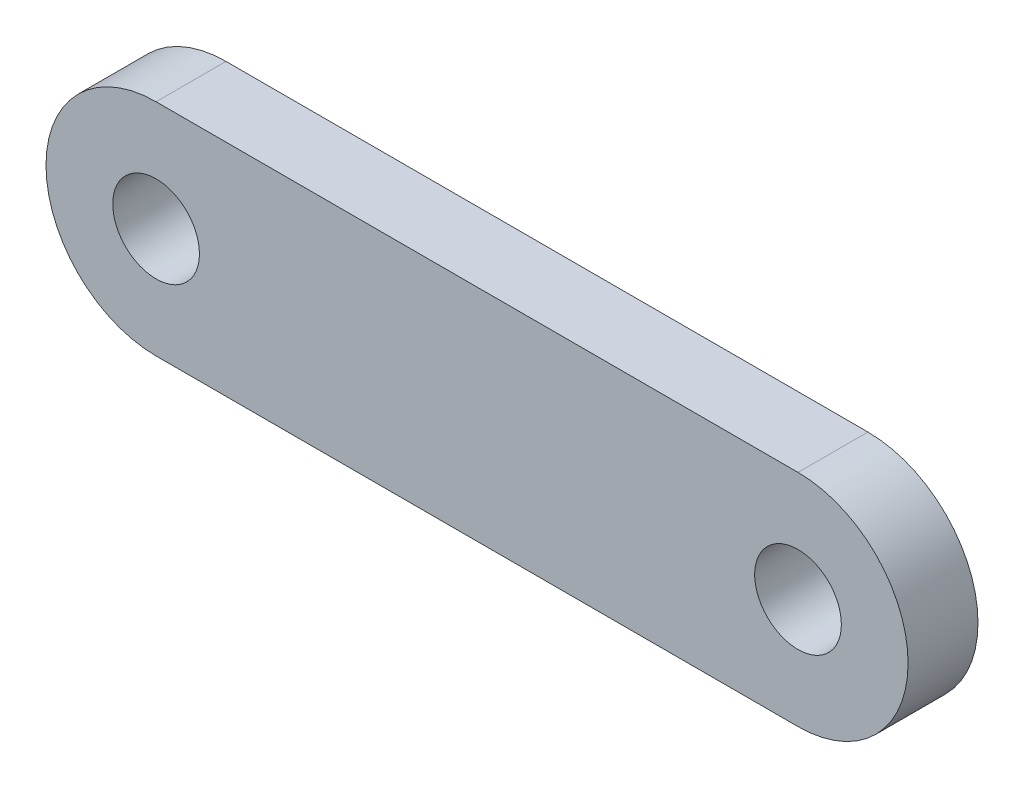
ISO-10303-21;
HEADER;
FILE_DESCRIPTION(('STEP AP214'),'2;1');
FILE_NAME('part.step','',(''),(''),'','','');
FILE_SCHEMA(('AUTOMOTIVE_DESIGN { 1 0 10303 214 1 1 1 1 }'));
ENDSEC;
DATA;
#1=APPLICATION_CONTEXT('core data for automotive mechanical design processes');
#2=APPLICATION_PROTOCOL_DEFINITION('international standard','automotive_design',2000,#1);
#3=PRODUCT_CONTEXT('',#1,'mechanical');
#4=PRODUCT('Part','Part','',(#3));
#5=PRODUCT_RELATED_PRODUCT_CATEGORY('part','',(#4));
#6=PRODUCT_DEFINITION_FORMATION('','',#4);
#7=PRODUCT_DEFINITION_CONTEXT('part definition',#1,'design');
#8=PRODUCT_DEFINITION('design','',#6,#7);
#9=PRODUCT_DEFINITION_SHAPE('','',#8);
#10=(LENGTH_UNIT() NAMED_UNIT(*) SI_UNIT(.MILLI.,.METRE.));
#11=(NAMED_UNIT(*) PLANE_ANGLE_UNIT() SI_UNIT($,.RADIAN.));
#12=(NAMED_UNIT(*) SI_UNIT($,.STERADIAN.) SOLID_ANGLE_UNIT());
#13=UNCERTAINTY_MEASURE_WITH_UNIT(LENGTH_MEASURE(1.E-05),#10,'distance_accuracy_value','');
#14=(GEOMETRIC_REPRESENTATION_CONTEXT(3) GLOBAL_UNCERTAINTY_ASSIGNED_CONTEXT((#13)) GLOBAL_UNIT_ASSIGNED_CONTEXT((#10,
#11,#12)) REPRESENTATION_CONTEXT('',''));
#15=CARTESIAN_POINT('',(0.,0.,0.));
#16=DIRECTION('',(0.,0.,1.));
#17=DIRECTION('',(1.,0.,0.));
#18=AXIS2_PLACEMENT_3D('',#15,#16,#17);
#19=CARTESIAN_POINT('',(-29.15466953,0.,6.35));
#20=DIRECTION('',(0.,0.,1.));
#21=DIRECTION('',(1.,0.,0.));
#22=AXIS2_PLACEMENT_3D('',#19,#20,#21);
#23=PLANE('',#22);
#24=CARTESIAN_POINT('',(-29.15466953,0.,6.35));
#25=DIRECTION('',(0.,0.,1.));
#26=DIRECTION('',(1.,0.,0.));
#27=AXIS2_PLACEMENT_3D('',#24,#25,#26);
#28=CIRCLE('',#27,3.9375);
#29=CARTESIAN_POINT('',(-25.21716953,0.,6.35));
#30=VERTEX_POINT('',#29);
#31=EDGE_CURVE('E125',#30,#30,#28,.T.);
#32=ORIENTED_EDGE('',*,*,#31,.F.);
#33=EDGE_LOOP('',(#32));
#34=FACE_BOUND('',#33,.T.);
#35=CARTESIAN_POINT('',(-29.15466953,0.,6.35));
#36=DIRECTION('',(0.,0.,1.));
#37=DIRECTION('',(1.,0.,0.));
#38=AXIS2_PLACEMENT_3D('',#35,#36,#37);
#39=CIRCLE('',#38,10.);
#40=CARTESIAN_POINT('',(-29.15466953,10.,6.35));
#41=VERTEX_POINT('',#40);
#42=CARTESIAN_POINT('',(-29.15466953,-10.,6.35));
#43=VERTEX_POINT('',#42);
#44=EDGE_CURVE('E99',#41,#43,#39,.T.);
#45=ORIENTED_EDGE('',*,*,#44,.T.);
#46=DIRECTION('',(1.,0.,0.));
#47=VECTOR('',#46,1.);
#48=CARTESIAN_POINT('',(-29.15466953,-10.,6.35));
#49=LINE('',#48,#47);
#50=CARTESIAN_POINT('',(29.15466953,-9.99999999999999,6.35));
#51=VERTEX_POINT('',#50);
#52=EDGE_CURVE('E95',#43,#51,#49,.T.);
#53=ORIENTED_EDGE('',*,*,#52,.T.);
#54=CARTESIAN_POINT('',(29.15466953,0.,6.35));
#55=DIRECTION('',(0.,0.,1.));
#56=DIRECTION('',(1.,0.,0.));
#57=AXIS2_PLACEMENT_3D('',#54,#55,#56);
#58=CIRCLE('',#57,10.);
#59=CARTESIAN_POINT('',(29.15466953,10.,6.35));
#60=VERTEX_POINT('',#59);
#61=EDGE_CURVE('E96',#51,#60,#58,.T.);
#62=ORIENTED_EDGE('',*,*,#61,.T.);
#63=DIRECTION('',(-1.,0.,0.));
#64=VECTOR('',#63,1.);
#65=CARTESIAN_POINT('',(-29.15466953,10.,6.35));
#66=LINE('',#65,#64);
#67=EDGE_CURVE('E62',#60,#41,#66,.T.);
#68=ORIENTED_EDGE('',*,*,#67,.T.);
#69=EDGE_LOOP('',(#45,#53,#62,#68));
#70=FACE_BOUND('',#69,.T.);
#71=CARTESIAN_POINT('',(29.15466953,0.,6.35));
#72=DIRECTION('',(0.,0.,1.));
#73=DIRECTION('',(1.,0.,0.));
#74=AXIS2_PLACEMENT_3D('',#71,#72,#73);
#75=CIRCLE('',#74,3.9375);
#76=CARTESIAN_POINT('',(33.09216953,0.,6.35));
#77=VERTEX_POINT('',#76);
#78=EDGE_CURVE('E150',#77,#77,#75,.T.);
#79=ORIENTED_EDGE('',*,*,#78,.F.);
#80=EDGE_LOOP('',(#79));
#81=FACE_BOUND('',#80,.T.);
#82=ADVANCED_FACE('F50',(#34,#70,#81),#23,.T.);
#83=CARTESIAN_POINT('',(-29.15466953,0.,0.));
#84=DIRECTION('',(0.,0.,1.));
#85=DIRECTION('',(1.,0.,0.));
#86=AXIS2_PLACEMENT_3D('',#83,#84,#85);
#87=PLANE('',#86);
#88=CARTESIAN_POINT('',(-29.15466953,0.,0.));
#89=DIRECTION('',(0.,0.,1.));
#90=DIRECTION('',(1.,0.,0.));
#91=AXIS2_PLACEMENT_3D('',#88,#89,#90);
#92=CIRCLE('',#91,10.);
#93=CARTESIAN_POINT('',(-29.15466953,10.,0.));
#94=VERTEX_POINT('',#93);
#95=CARTESIAN_POINT('',(-29.15466953,-10.,0.));
#96=VERTEX_POINT('',#95);
#97=EDGE_CURVE('E117',#94,#96,#92,.T.);
#98=ORIENTED_EDGE('',*,*,#97,.F.);
#99=DIRECTION('',(-1.,0.,0.));
#100=VECTOR('',#99,1.);
#101=CARTESIAN_POINT('',(-29.15466953,10.,0.));
#102=LINE('',#101,#100);
#103=CARTESIAN_POINT('',(29.15466953,10.,0.));
#104=VERTEX_POINT('',#103);
#105=EDGE_CURVE('E88',#104,#94,#102,.T.);
#106=ORIENTED_EDGE('',*,*,#105,.F.);
#107=CARTESIAN_POINT('',(29.15466953,0.,0.));
#108=DIRECTION('',(0.,0.,1.));
#109=DIRECTION('',(1.,0.,0.));
#110=AXIS2_PLACEMENT_3D('',#107,#108,#109);
#111=CIRCLE('',#110,10.);
#112=CARTESIAN_POINT('',(29.15466953,-9.99999999999999,0.));
#113=VERTEX_POINT('',#112);
#114=EDGE_CURVE('E81',#113,#104,#111,.T.);
#115=ORIENTED_EDGE('',*,*,#114,.F.);
#116=DIRECTION('',(1.,0.,0.));
#117=VECTOR('',#116,1.);
#118=CARTESIAN_POINT('',(-29.15466953,-10.,0.));
#119=LINE('',#118,#117);
#120=EDGE_CURVE('E102',#96,#113,#119,.T.);
#121=ORIENTED_EDGE('',*,*,#120,.F.);
#122=EDGE_LOOP('',(#98,#106,#115,#121));
#123=FACE_BOUND('',#122,.T.);
#124=CARTESIAN_POINT('',(-29.15466953,0.,0.));
#125=DIRECTION('',(0.,0.,1.));
#126=DIRECTION('',(1.,0.,0.));
#127=AXIS2_PLACEMENT_3D('',#124,#125,#126);
#128=CIRCLE('',#127,3.9375);
#129=CARTESIAN_POINT('',(-25.21716953,0.,0.));
#130=VERTEX_POINT('',#129);
#131=EDGE_CURVE('E144',#130,#130,#128,.T.);
#132=ORIENTED_EDGE('',*,*,#131,.T.);
#133=EDGE_LOOP('',(#132));
#134=FACE_BOUND('',#133,.T.);
#135=CARTESIAN_POINT('',(29.15466953,0.,0.));
#136=DIRECTION('',(0.,0.,1.));
#137=DIRECTION('',(1.,0.,0.));
#138=AXIS2_PLACEMENT_3D('',#135,#136,#137);
#139=CIRCLE('',#138,3.9375);
#140=CARTESIAN_POINT('',(33.09216953,0.,0.));
#141=VERTEX_POINT('',#140);
#142=EDGE_CURVE('E155',#141,#141,#139,.T.);
#143=ORIENTED_EDGE('',*,*,#142,.T.);
#144=EDGE_LOOP('',(#143));
#145=FACE_BOUND('',#144,.T.);
#146=ADVANCED_FACE('F137',(#123,#134,#145),#87,.F.);
#147=CARTESIAN_POINT('',(-29.15466953,0.,6.35));
#148=DIRECTION('',(0.,0.,-1.));
#149=DIRECTION('',(-1.,0.,0.));
#150=AXIS2_PLACEMENT_3D('',#147,#148,#149);
#151=CYLINDRICAL_SURFACE('',#150,10.);
#152=ORIENTED_EDGE('',*,*,#97,.T.);
#153=DIRECTION('',(0.,0.,-1.));
#154=VECTOR('',#153,1.);
#155=CARTESIAN_POINT('',(-29.15466953,-10.,6.35));
#156=LINE('',#155,#154);
#157=EDGE_CURVE('E11',#43,#96,#156,.T.);
#158=ORIENTED_EDGE('',*,*,#157,.F.);
#159=ORIENTED_EDGE('',*,*,#44,.F.);
#160=DIRECTION('',(0.,0.,-1.));
#161=VECTOR('',#160,1.);
#162=CARTESIAN_POINT('',(-29.15466953,10.,6.35));
#163=LINE('',#162,#161);
#164=EDGE_CURVE('E112',#41,#94,#163,.T.);
#165=ORIENTED_EDGE('',*,*,#164,.T.);
#166=EDGE_LOOP('',(#152,#158,#159,#165));
#167=FACE_BOUND('',#166,.T.);
#168=ADVANCED_FACE('F47',(#167),#151,.T.);
#169=CARTESIAN_POINT('',(-29.15466953,-10.,6.35));
#170=DIRECTION('',(0.,1.,0.));
#171=DIRECTION('',(-1.,0.,0.));
#172=AXIS2_PLACEMENT_3D('',#169,#170,#171);
#173=PLANE('',#172);
#174=ORIENTED_EDGE('',*,*,#120,.T.);
#175=DIRECTION('',(0.,0.,-1.));
#176=VECTOR('',#175,1.);
#177=CARTESIAN_POINT('',(29.15466953,-9.99999999999999,6.35));
#178=LINE('',#177,#176);
#179=EDGE_CURVE('E60',#51,#113,#178,.T.);
#180=ORIENTED_EDGE('',*,*,#179,.F.);
#181=ORIENTED_EDGE('',*,*,#52,.F.);
#182=ORIENTED_EDGE('',*,*,#157,.T.);
#183=EDGE_LOOP('',(#174,#180,#181,#182));
#184=FACE_BOUND('',#183,.T.);
#185=ADVANCED_FACE('F104',(#184),#173,.F.);
#186=CARTESIAN_POINT('',(29.15466953,0.,6.35));
#187=DIRECTION('',(0.,0.,-1.));
#188=DIRECTION('',(-1.,0.,0.));
#189=AXIS2_PLACEMENT_3D('',#186,#187,#188);
#190=CYLINDRICAL_SURFACE('',#189,10.);
#191=ORIENTED_EDGE('',*,*,#114,.T.);
#192=DIRECTION('',(0.,0.,-1.));
#193=VECTOR('',#192,1.);
#194=CARTESIAN_POINT('',(29.15466953,10.,6.35));
#195=LINE('',#194,#193);
#196=EDGE_CURVE('E110',#60,#104,#195,.T.);
#197=ORIENTED_EDGE('',*,*,#196,.F.);
#198=ORIENTED_EDGE('',*,*,#61,.F.);
#199=ORIENTED_EDGE('',*,*,#179,.T.);
#200=EDGE_LOOP('',(#191,#197,#198,#199));
#201=FACE_BOUND('',#200,.T.);
#202=ADVANCED_FACE('F108',(#201),#190,.T.);
#203=CARTESIAN_POINT('',(-29.15466953,10.,6.35));
#204=DIRECTION('',(0.,-1.,0.));
#205=DIRECTION('',(1.,0.,0.));
#206=AXIS2_PLACEMENT_3D('',#203,#204,#205);
#207=PLANE('',#206);
#208=ORIENTED_EDGE('',*,*,#105,.T.);
#209=ORIENTED_EDGE('',*,*,#164,.F.);
#210=ORIENTED_EDGE('',*,*,#67,.F.);
#211=ORIENTED_EDGE('',*,*,#196,.T.);
#212=EDGE_LOOP('',(#208,#209,#210,#211));
#213=FACE_BOUND('',#212,.T.);
#214=ADVANCED_FACE('F134',(#213),#207,.F.);
#215=CARTESIAN_POINT('',(-29.15466953,0.,6.35));
#216=DIRECTION('',(0.,0.,-1.));
#217=DIRECTION('',(-1.,0.,0.));
#218=AXIS2_PLACEMENT_3D('',#215,#216,#217);
#219=CYLINDRICAL_SURFACE('',#218,3.9375);
#220=ORIENTED_EDGE('',*,*,#31,.T.);
#221=EDGE_LOOP('',(#220));
#222=FACE_BOUND('',#221,.T.);
#223=ORIENTED_EDGE('',*,*,#131,.F.);
#224=EDGE_LOOP('',(#223));
#225=FACE_BOUND('',#224,.T.);
#226=ADVANCED_FACE('F173',(#222,#225),#219,.F.);
#227=CARTESIAN_POINT('',(29.15466953,0.,6.35));
#228=DIRECTION('',(0.,0.,-1.));
#229=DIRECTION('',(-1.,0.,0.));
#230=AXIS2_PLACEMENT_3D('',#227,#228,#229);
#231=CYLINDRICAL_SURFACE('',#230,3.9375);
#232=ORIENTED_EDGE('',*,*,#78,.T.);
#233=EDGE_LOOP('',(#232));
#234=FACE_BOUND('',#233,.T.);
#235=ORIENTED_EDGE('',*,*,#142,.F.);
#236=EDGE_LOOP('',(#235));
#237=FACE_BOUND('',#236,.T.);
#238=ADVANCED_FACE('F162',(#234,#237),#231,.F.);
#239=CLOSED_SHELL('',(#82,#146,#168,#185,#202,#214,#226,#238));
#240=MANIFOLD_SOLID_BREP('B2',#239);
#241=ADVANCED_BREP_SHAPE_REPRESENTATION('',(#18,#240),#14);
#242=SHAPE_DEFINITION_REPRESENTATION(#9,#241);
ENDSEC;
END-ISO-10303-21;
